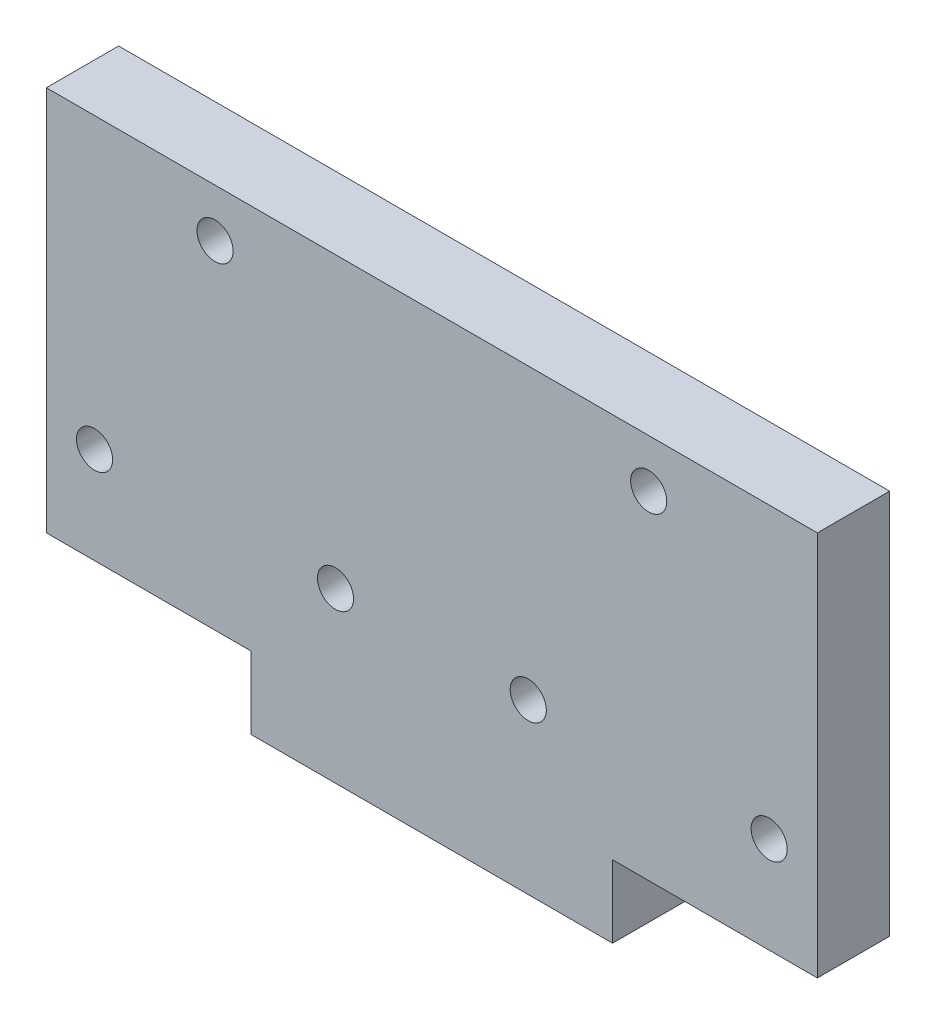
ISO-10303-21;
HEADER;
FILE_DESCRIPTION(('STEP AP214'),'2;1');
FILE_NAME('part.step','',(''),(''),'','','');
FILE_SCHEMA(('AUTOMOTIVE_DESIGN { 1 0 10303 214 1 1 1 1 }'));
ENDSEC;
DATA;
#1=APPLICATION_CONTEXT('core data for automotive mechanical design processes');
#2=APPLICATION_PROTOCOL_DEFINITION('international standard','automotive_design',2000,#1);
#3=PRODUCT_CONTEXT('',#1,'mechanical');
#4=PRODUCT('Part','Part','',(#3));
#5=PRODUCT_RELATED_PRODUCT_CATEGORY('part','',(#4));
#6=PRODUCT_DEFINITION_FORMATION('','',#4);
#7=PRODUCT_DEFINITION_CONTEXT('part definition',#1,'design');
#8=PRODUCT_DEFINITION('design','',#6,#7);
#9=PRODUCT_DEFINITION_SHAPE('','',#8);
#10=(LENGTH_UNIT() NAMED_UNIT(*) SI_UNIT(.MILLI.,.METRE.));
#11=(NAMED_UNIT(*) PLANE_ANGLE_UNIT() SI_UNIT($,.RADIAN.));
#12=(NAMED_UNIT(*) SI_UNIT($,.STERADIAN.) SOLID_ANGLE_UNIT());
#13=UNCERTAINTY_MEASURE_WITH_UNIT(LENGTH_MEASURE(1.E-05),#10,'distance_accuracy_value','');
#14=(GEOMETRIC_REPRESENTATION_CONTEXT(3) GLOBAL_UNCERTAINTY_ASSIGNED_CONTEXT((#13)) GLOBAL_UNIT_ASSIGNED_CONTEXT((#10,
#11,#12)) REPRESENTATION_CONTEXT('',''));
#15=CARTESIAN_POINT('',(0.,0.,0.));
#16=DIRECTION('',(0.,0.,1.));
#17=DIRECTION('',(1.,0.,0.));
#18=AXIS2_PLACEMENT_3D('',#15,#16,#17);
#19=CARTESIAN_POINT('',(-50.,-4.,6.));
#20=DIRECTION('',(0.,0.,-1.));
#21=DIRECTION('',(-1.,0.,0.));
#22=AXIS2_PLACEMENT_3D('',#19,#20,#21);
#23=CYLINDRICAL_SURFACE('',#22,1.5);
#24=CARTESIAN_POINT('',(-50.,-4.,6.));
#25=DIRECTION('',(0.,0.,-1.));
#26=DIRECTION('',(1.,0.,0.));
#27=AXIS2_PLACEMENT_3D('',#24,#25,#26);
#28=CIRCLE('',#27,1.5);
#29=CARTESIAN_POINT('',(-48.5,-4.,6.));
#30=VERTEX_POINT('',#29);
#31=EDGE_CURVE('E161',#30,#30,#28,.T.);
#32=ORIENTED_EDGE('',*,*,#31,.F.);
#33=EDGE_LOOP('',(#32));
#34=FACE_BOUND('',#33,.T.);
#35=CARTESIAN_POINT('',(-50.,-4.,3.));
#36=DIRECTION('',(0.,0.,-1.));
#37=DIRECTION('',(-1.,0.,0.));
#38=AXIS2_PLACEMENT_3D('',#35,#36,#37);
#39=CIRCLE('',#38,1.5);
#40=CARTESIAN_POINT('',(-51.5,-4.,3.));
#41=VERTEX_POINT('',#40);
#42=EDGE_CURVE('E36',#41,#41,#39,.F.);
#43=ORIENTED_EDGE('',*,*,#42,.F.);
#44=EDGE_LOOP('',(#43));
#45=FACE_BOUND('',#44,.T.);
#46=ADVANCED_FACE('F32',(#34,#45),#23,.F.);
#47=CARTESIAN_POINT('',(-60.,-24.,6.));
#48=DIRECTION('',(0.,0.,-1.));
#49=DIRECTION('',(-1.,0.,0.));
#50=AXIS2_PLACEMENT_3D('',#47,#48,#49);
#51=CYLINDRICAL_SURFACE('',#50,1.5);
#52=CARTESIAN_POINT('',(-60.,-24.,6.));
#53=DIRECTION('',(0.,0.,-1.));
#54=DIRECTION('',(1.,0.,0.));
#55=AXIS2_PLACEMENT_3D('',#52,#53,#54);
#56=CIRCLE('',#55,1.5);
#57=CARTESIAN_POINT('',(-58.5,-24.,6.));
#58=VERTEX_POINT('',#57);
#59=EDGE_CURVE('E212',#58,#58,#56,.T.);
#60=ORIENTED_EDGE('',*,*,#59,.F.);
#61=EDGE_LOOP('',(#60));
#62=FACE_BOUND('',#61,.T.);
#63=CARTESIAN_POINT('',(-60.,-24.,3.));
#64=DIRECTION('',(0.,0.,-1.));
#65=DIRECTION('',(-1.,0.,0.));
#66=AXIS2_PLACEMENT_3D('',#63,#64,#65);
#67=CIRCLE('',#66,1.5);
#68=CARTESIAN_POINT('',(-61.5,-24.,3.));
#69=VERTEX_POINT('',#68);
#70=EDGE_CURVE('E177',#69,#69,#67,.F.);
#71=ORIENTED_EDGE('',*,*,#70,.F.);
#72=EDGE_LOOP('',(#71));
#73=FACE_BOUND('',#72,.T.);
#74=ADVANCED_FACE('F260',(#62,#73),#51,.F.);
#75=CARTESIAN_POINT('',(-40.,-24.,6.));
#76=DIRECTION('',(0.,0.,-1.));
#77=DIRECTION('',(-1.,0.,0.));
#78=AXIS2_PLACEMENT_3D('',#75,#76,#77);
#79=CYLINDRICAL_SURFACE('',#78,1.5);
#80=CARTESIAN_POINT('',(-40.,-24.,6.));
#81=DIRECTION('',(0.,0.,-1.));
#82=DIRECTION('',(1.,0.,0.));
#83=AXIS2_PLACEMENT_3D('',#80,#81,#82);
#84=CIRCLE('',#83,1.5);
#85=CARTESIAN_POINT('',(-38.5,-24.,6.));
#86=VERTEX_POINT('',#85);
#87=EDGE_CURVE('E215',#86,#86,#84,.T.);
#88=ORIENTED_EDGE('',*,*,#87,.F.);
#89=EDGE_LOOP('',(#88));
#90=FACE_BOUND('',#89,.T.);
#91=CARTESIAN_POINT('',(-40.,-24.,3.));
#92=DIRECTION('',(0.,0.,-1.));
#93=DIRECTION('',(-1.,0.,0.));
#94=AXIS2_PLACEMENT_3D('',#91,#92,#93);
#95=CIRCLE('',#94,1.5);
#96=CARTESIAN_POINT('',(-41.5,-24.,3.));
#97=VERTEX_POINT('',#96);
#98=EDGE_CURVE('E173',#97,#97,#95,.F.);
#99=ORIENTED_EDGE('',*,*,#98,.F.);
#100=EDGE_LOOP('',(#99));
#101=FACE_BOUND('',#100,.T.);
#102=ADVANCED_FACE('F266',(#90,#101),#79,.F.);
#103=CARTESIAN_POINT('',(-24.,-24.,6.));
#104=DIRECTION('',(0.,0.,-1.));
#105=DIRECTION('',(-1.,0.,0.));
#106=AXIS2_PLACEMENT_3D('',#103,#104,#105);
#107=CYLINDRICAL_SURFACE('',#106,1.5);
#108=CARTESIAN_POINT('',(-24.,-24.,6.));
#109=DIRECTION('',(0.,0.,-1.));
#110=DIRECTION('',(-1.,0.,0.));
#111=AXIS2_PLACEMENT_3D('',#108,#109,#110);
#112=CIRCLE('',#111,1.5);
#113=CARTESIAN_POINT('',(-25.5,-24.,6.));
#114=VERTEX_POINT('',#113);
#115=EDGE_CURVE('E218',#114,#114,#112,.T.);
#116=ORIENTED_EDGE('',*,*,#115,.F.);
#117=EDGE_LOOP('',(#116));
#118=FACE_BOUND('',#117,.T.);
#119=CARTESIAN_POINT('',(-24.,-24.,3.));
#120=DIRECTION('',(0.,0.,-1.));
#121=DIRECTION('',(-1.,0.,0.));
#122=AXIS2_PLACEMENT_3D('',#119,#120,#121);
#123=CIRCLE('',#122,1.5);
#124=CARTESIAN_POINT('',(-25.5,-24.,3.));
#125=VERTEX_POINT('',#124);
#126=EDGE_CURVE('E168',#125,#125,#123,.F.);
#127=ORIENTED_EDGE('',*,*,#126,.F.);
#128=EDGE_LOOP('',(#127));
#129=FACE_BOUND('',#128,.T.);
#130=ADVANCED_FACE('F277',(#118,#129),#107,.F.);
#131=CARTESIAN_POINT('',(-4.,-24.,6.));
#132=DIRECTION('',(0.,0.,-1.));
#133=DIRECTION('',(-1.,0.,0.));
#134=AXIS2_PLACEMENT_3D('',#131,#132,#133);
#135=CYLINDRICAL_SURFACE('',#134,1.5);
#136=CARTESIAN_POINT('',(-4.,-24.,6.));
#137=DIRECTION('',(0.,0.,-1.));
#138=DIRECTION('',(-1.,0.,0.));
#139=AXIS2_PLACEMENT_3D('',#136,#137,#138);
#140=CIRCLE('',#139,1.5);
#141=CARTESIAN_POINT('',(-5.5,-24.,6.));
#142=VERTEX_POINT('',#141);
#143=EDGE_CURVE('E221',#142,#142,#140,.T.);
#144=ORIENTED_EDGE('',*,*,#143,.F.);
#145=EDGE_LOOP('',(#144));
#146=FACE_BOUND('',#145,.T.);
#147=CARTESIAN_POINT('',(-4.,-24.,3.));
#148=DIRECTION('',(0.,0.,-1.));
#149=DIRECTION('',(-1.,0.,0.));
#150=AXIS2_PLACEMENT_3D('',#147,#148,#149);
#151=CIRCLE('',#150,1.5);
#152=CARTESIAN_POINT('',(-5.5,-24.,3.));
#153=VERTEX_POINT('',#152);
#154=EDGE_CURVE('E163',#153,#153,#151,.F.);
#155=ORIENTED_EDGE('',*,*,#154,.F.);
#156=EDGE_LOOP('',(#155));
#157=FACE_BOUND('',#156,.T.);
#158=ADVANCED_FACE('F281',(#146,#157),#135,.F.);
#159=CARTESIAN_POINT('',(-14.,-4.,6.));
#160=DIRECTION('',(0.,0.,-1.));
#161=DIRECTION('',(-1.,0.,0.));
#162=AXIS2_PLACEMENT_3D('',#159,#160,#161);
#163=CYLINDRICAL_SURFACE('',#162,1.5);
#164=CARTESIAN_POINT('',(-14.,-4.,6.));
#165=DIRECTION('',(0.,0.,-1.));
#166=DIRECTION('',(-1.,0.,0.));
#167=AXIS2_PLACEMENT_3D('',#164,#165,#166);
#168=CIRCLE('',#167,1.5);
#169=CARTESIAN_POINT('',(-15.5,-4.,6.));
#170=VERTEX_POINT('',#169);
#171=EDGE_CURVE('E135',#170,#170,#168,.T.);
#172=ORIENTED_EDGE('',*,*,#171,.F.);
#173=EDGE_LOOP('',(#172));
#174=FACE_BOUND('',#173,.T.);
#175=CARTESIAN_POINT('',(-14.,-4.,3.));
#176=DIRECTION('',(0.,0.,-1.));
#177=DIRECTION('',(-1.,0.,0.));
#178=AXIS2_PLACEMENT_3D('',#175,#176,#177);
#179=CIRCLE('',#178,1.5);
#180=CARTESIAN_POINT('',(-15.5,-4.,3.));
#181=VERTEX_POINT('',#180);
#182=EDGE_CURVE('E158',#181,#181,#179,.F.);
#183=ORIENTED_EDGE('',*,*,#182,.F.);
#184=EDGE_LOOP('',(#183));
#185=FACE_BOUND('',#184,.T.);
#186=ADVANCED_FACE('F285',(#174,#185),#163,.F.);
#187=CARTESIAN_POINT('',(0.,0.,6.));
#188=DIRECTION('',(-1.,0.,0.));
#189=DIRECTION('',(0.,-1.,0.));
#190=AXIS2_PLACEMENT_3D('',#187,#188,#189);
#191=PLANE('',#190);
#192=DIRECTION('',(0.,1.,0.));
#193=VECTOR('',#192,1.);
#194=CARTESIAN_POINT('',(0.,0.,0.));
#195=LINE('',#194,#193);
#196=CARTESIAN_POINT('',(0.,-32.,0.));
#197=VERTEX_POINT('',#196);
#198=CARTESIAN_POINT('',(0.,0.,0.));
#199=VERTEX_POINT('',#198);
#200=EDGE_CURVE('E131',#197,#199,#195,.T.);
#201=ORIENTED_EDGE('',*,*,#200,.T.);
#202=DIRECTION('',(0.,0.,-1.));
#203=VECTOR('',#202,1.);
#204=CARTESIAN_POINT('',(0.,0.,6.));
#205=LINE('',#204,#203);
#206=CARTESIAN_POINT('',(0.,0.,6.));
#207=VERTEX_POINT('',#206);
#208=EDGE_CURVE('E11',#207,#199,#205,.T.);
#209=ORIENTED_EDGE('',*,*,#208,.F.);
#210=DIRECTION('',(0.,1.,0.));
#211=VECTOR('',#210,1.);
#212=CARTESIAN_POINT('',(0.,0.,6.));
#213=LINE('',#212,#211);
#214=CARTESIAN_POINT('',(0.,-32.,6.));
#215=VERTEX_POINT('',#214);
#216=EDGE_CURVE('E146',#215,#207,#213,.T.);
#217=ORIENTED_EDGE('',*,*,#216,.F.);
#218=DIRECTION('',(0.,0.,-1.));
#219=VECTOR('',#218,1.);
#220=CARTESIAN_POINT('',(0.,-32.,6.));
#221=LINE('',#220,#219);
#222=EDGE_CURVE('E127',#215,#197,#221,.T.);
#223=ORIENTED_EDGE('',*,*,#222,.T.);
#224=EDGE_LOOP('',(#201,#209,#217,#223));
#225=FACE_BOUND('',#224,.T.);
#226=ADVANCED_FACE('F34',(#225),#191,.F.);
#227=CARTESIAN_POINT('',(0.,0.,6.));
#228=DIRECTION('',(0.,-1.,0.));
#229=DIRECTION('',(1.,0.,0.));
#230=AXIS2_PLACEMENT_3D('',#227,#228,#229);
#231=PLANE('',#230);
#232=DIRECTION('',(-1.,0.,0.));
#233=VECTOR('',#232,1.);
#234=CARTESIAN_POINT('',(0.,0.,0.));
#235=LINE('',#234,#233);
#236=CARTESIAN_POINT('',(-64.,0.,0.));
#237=VERTEX_POINT('',#236);
#238=EDGE_CURVE('E134',#199,#237,#235,.T.);
#239=ORIENTED_EDGE('',*,*,#238,.T.);
#240=DIRECTION('',(0.,0.,-1.));
#241=VECTOR('',#240,1.);
#242=CARTESIAN_POINT('',(-64.,0.,6.));
#243=LINE('',#242,#241);
#244=CARTESIAN_POINT('',(-64.,0.,6.));
#245=VERTEX_POINT('',#244);
#246=EDGE_CURVE('E42',#245,#237,#243,.T.);
#247=ORIENTED_EDGE('',*,*,#246,.F.);
#248=DIRECTION('',(-1.,0.,0.));
#249=VECTOR('',#248,1.);
#250=CARTESIAN_POINT('',(0.,0.,6.));
#251=LINE('',#250,#249);
#252=EDGE_CURVE('E94',#207,#245,#251,.T.);
#253=ORIENTED_EDGE('',*,*,#252,.F.);
#254=ORIENTED_EDGE('',*,*,#208,.T.);
#255=EDGE_LOOP('',(#239,#247,#253,#254));
#256=FACE_BOUND('',#255,.T.);
#257=ADVANCED_FACE('F502',(#256),#231,.F.);
#258=CARTESIAN_POINT('',(-64.,0.,6.));
#259=DIRECTION('',(1.,0.,0.));
#260=DIRECTION('',(0.,0.,-1.));
#261=AXIS2_PLACEMENT_3D('',#258,#259,#260);
#262=PLANE('',#261);
#263=DIRECTION('',(0.,-1.,0.));
#264=VECTOR('',#263,1.);
#265=CARTESIAN_POINT('',(-64.,0.,0.));
#266=LINE('',#265,#264);
#267=CARTESIAN_POINT('',(-64.,-32.,0.));
#268=VERTEX_POINT('',#267);
#269=EDGE_CURVE('E137',#237,#268,#266,.T.);
#270=ORIENTED_EDGE('',*,*,#269,.T.);
#271=DIRECTION('',(0.,0.,-1.));
#272=VECTOR('',#271,1.);
#273=CARTESIAN_POINT('',(-64.,-32.,6.));
#274=LINE('',#273,#272);
#275=CARTESIAN_POINT('',(-64.,-32.,6.));
#276=VERTEX_POINT('',#275);
#277=EDGE_CURVE('E153',#276,#268,#274,.T.);
#278=ORIENTED_EDGE('',*,*,#277,.F.);
#279=DIRECTION('',(0.,-1.,0.));
#280=VECTOR('',#279,1.);
#281=CARTESIAN_POINT('',(-64.,0.,6.));
#282=LINE('',#281,#280);
#283=EDGE_CURVE('E228',#245,#276,#282,.T.);
#284=ORIENTED_EDGE('',*,*,#283,.F.);
#285=ORIENTED_EDGE('',*,*,#246,.T.);
#286=EDGE_LOOP('',(#270,#278,#284,#285));
#287=FACE_BOUND('',#286,.T.);
#288=ADVANCED_FACE('F494',(#287),#262,.F.);
#289=CARTESIAN_POINT('',(-47.,-32.,6.));
#290=DIRECTION('',(0.,1.,0.));
#291=DIRECTION('',(0.,0.,1.));
#292=AXIS2_PLACEMENT_3D('',#289,#290,#291);
#293=PLANE('',#292);
#294=DIRECTION('',(1.,0.,0.));
#295=VECTOR('',#294,1.);
#296=CARTESIAN_POINT('',(-47.,-32.,0.));
#297=LINE('',#296,#295);
#298=CARTESIAN_POINT('',(-47.,-32.,0.));
#299=VERTEX_POINT('',#298);
#300=EDGE_CURVE('E139',#268,#299,#297,.T.);
#301=ORIENTED_EDGE('',*,*,#300,.T.);
#302=DIRECTION('',(0.,0.,-1.));
#303=VECTOR('',#302,1.);
#304=CARTESIAN_POINT('',(-47.,-32.,6.));
#305=LINE('',#304,#303);
#306=CARTESIAN_POINT('',(-47.,-32.,6.));
#307=VERTEX_POINT('',#306);
#308=EDGE_CURVE('E150',#307,#299,#305,.T.);
#309=ORIENTED_EDGE('',*,*,#308,.F.);
#310=DIRECTION('',(1.,0.,0.));
#311=VECTOR('',#310,1.);
#312=CARTESIAN_POINT('',(-47.,-32.,6.));
#313=LINE('',#312,#311);
#314=EDGE_CURVE('E230',#276,#307,#313,.T.);
#315=ORIENTED_EDGE('',*,*,#314,.F.);
#316=ORIENTED_EDGE('',*,*,#277,.T.);
#317=EDGE_LOOP('',(#301,#309,#315,#316));
#318=FACE_BOUND('',#317,.T.);
#319=ADVANCED_FACE('F236',(#318),#293,.F.);
#320=CARTESIAN_POINT('',(-47.,-38.,6.));
#321=DIRECTION('',(1.,0.,0.));
#322=DIRECTION('',(0.,0.,-1.));
#323=AXIS2_PLACEMENT_3D('',#320,#321,#322);
#324=PLANE('',#323);
#325=DIRECTION('',(0.,-1.,0.));
#326=VECTOR('',#325,1.);
#327=CARTESIAN_POINT('',(-47.,-38.,0.));
#328=LINE('',#327,#326);
#329=CARTESIAN_POINT('',(-47.,-38.,0.));
#330=VERTEX_POINT('',#329);
#331=EDGE_CURVE('E141',#299,#330,#328,.T.);
#332=ORIENTED_EDGE('',*,*,#331,.T.);
#333=DIRECTION('',(0.,0.,-1.));
#334=VECTOR('',#333,1.);
#335=CARTESIAN_POINT('',(-47.,-38.,6.));
#336=LINE('',#335,#334);
#337=CARTESIAN_POINT('',(-47.,-38.,6.));
#338=VERTEX_POINT('',#337);
#339=EDGE_CURVE('E122',#338,#330,#336,.T.);
#340=ORIENTED_EDGE('',*,*,#339,.F.);
#341=DIRECTION('',(0.,-1.,0.));
#342=VECTOR('',#341,1.);
#343=CARTESIAN_POINT('',(-47.,-38.,6.));
#344=LINE('',#343,#342);
#345=EDGE_CURVE('E113',#307,#338,#344,.T.);
#346=ORIENTED_EDGE('',*,*,#345,.F.);
#347=ORIENTED_EDGE('',*,*,#308,.T.);
#348=EDGE_LOOP('',(#332,#340,#346,#347));
#349=FACE_BOUND('',#348,.T.);
#350=ADVANCED_FACE('F240',(#349),#324,.F.);
#351=CARTESIAN_POINT('',(-17.,-38.,6.));
#352=DIRECTION('',(0.,1.,0.));
#353=DIRECTION('',(-1.,0.,0.));
#354=AXIS2_PLACEMENT_3D('',#351,#352,#353);
#355=PLANE('',#354);
#356=DIRECTION('',(1.,0.,0.));
#357=VECTOR('',#356,1.);
#358=CARTESIAN_POINT('',(-17.,-38.,0.));
#359=LINE('',#358,#357);
#360=CARTESIAN_POINT('',(-17.,-38.,0.));
#361=VERTEX_POINT('',#360);
#362=EDGE_CURVE('E121',#330,#361,#359,.T.);
#363=ORIENTED_EDGE('',*,*,#362,.T.);
#364=DIRECTION('',(0.,0.,-1.));
#365=VECTOR('',#364,1.);
#366=CARTESIAN_POINT('',(-17.,-38.,6.));
#367=LINE('',#366,#365);
#368=CARTESIAN_POINT('',(-17.,-38.,6.));
#369=VERTEX_POINT('',#368);
#370=EDGE_CURVE('E118',#369,#361,#367,.T.);
#371=ORIENTED_EDGE('',*,*,#370,.F.);
#372=DIRECTION('',(1.,0.,0.));
#373=VECTOR('',#372,1.);
#374=CARTESIAN_POINT('',(-17.,-38.,6.));
#375=LINE('',#374,#373);
#376=EDGE_CURVE('E107',#338,#369,#375,.T.);
#377=ORIENTED_EDGE('',*,*,#376,.F.);
#378=ORIENTED_EDGE('',*,*,#339,.T.);
#379=EDGE_LOOP('',(#363,#371,#377,#378));
#380=FACE_BOUND('',#379,.T.);
#381=ADVANCED_FACE('F119',(#380),#355,.F.);
#382=CARTESIAN_POINT('',(-17.,-32.,6.));
#383=DIRECTION('',(-1.,0.,0.));
#384=DIRECTION('',(0.,0.,1.));
#385=AXIS2_PLACEMENT_3D('',#382,#383,#384);
#386=PLANE('',#385);
#387=DIRECTION('',(0.,1.,0.));
#388=VECTOR('',#387,1.);
#389=CARTESIAN_POINT('',(-17.,-32.,0.));
#390=LINE('',#389,#388);
#391=CARTESIAN_POINT('',(-17.,-32.,0.));
#392=VERTEX_POINT('',#391);
#393=EDGE_CURVE('E80',#361,#392,#390,.T.);
#394=ORIENTED_EDGE('',*,*,#393,.T.);
#395=DIRECTION('',(0.,0.,-1.));
#396=VECTOR('',#395,1.);
#397=CARTESIAN_POINT('',(-17.,-32.,6.));
#398=LINE('',#397,#396);
#399=CARTESIAN_POINT('',(-17.,-32.,6.));
#400=VERTEX_POINT('',#399);
#401=EDGE_CURVE('E123',#400,#392,#398,.T.);
#402=ORIENTED_EDGE('',*,*,#401,.F.);
#403=DIRECTION('',(0.,1.,0.));
#404=VECTOR('',#403,1.);
#405=CARTESIAN_POINT('',(-17.,-32.,6.));
#406=LINE('',#405,#404);
#407=EDGE_CURVE('E111',#369,#400,#406,.T.);
#408=ORIENTED_EDGE('',*,*,#407,.F.);
#409=ORIENTED_EDGE('',*,*,#370,.T.);
#410=EDGE_LOOP('',(#394,#402,#408,#409));
#411=FACE_BOUND('',#410,.T.);
#412=ADVANCED_FACE('F125',(#411),#386,.F.);
#413=CARTESIAN_POINT('',(0.,-32.,6.));
#414=DIRECTION('',(0.,1.,0.));
#415=DIRECTION('',(0.,0.,1.));
#416=AXIS2_PLACEMENT_3D('',#413,#414,#415);
#417=PLANE('',#416);
#418=DIRECTION('',(1.,0.,0.));
#419=VECTOR('',#418,1.);
#420=CARTESIAN_POINT('',(0.,-32.,0.));
#421=LINE('',#420,#419);
#422=EDGE_CURVE('E86',#392,#197,#421,.T.);
#423=ORIENTED_EDGE('',*,*,#422,.T.);
#424=ORIENTED_EDGE('',*,*,#222,.F.);
#425=DIRECTION('',(1.,0.,0.));
#426=VECTOR('',#425,1.);
#427=CARTESIAN_POINT('',(0.,-32.,6.));
#428=LINE('',#427,#426);
#429=EDGE_CURVE('E51',#400,#215,#428,.T.);
#430=ORIENTED_EDGE('',*,*,#429,.F.);
#431=ORIENTED_EDGE('',*,*,#401,.T.);
#432=EDGE_LOOP('',(#423,#424,#430,#431));
#433=FACE_BOUND('',#432,.T.);
#434=ADVANCED_FACE('F248',(#433),#417,.F.);
#435=CARTESIAN_POINT('',(0.,0.,6.));
#436=DIRECTION('',(0.,0.,-1.));
#437=DIRECTION('',(-1.,0.,0.));
#438=AXIS2_PLACEMENT_3D('',#435,#436,#437);
#439=PLANE('',#438);
#440=ORIENTED_EDGE('',*,*,#31,.T.);
#441=EDGE_LOOP('',(#440));
#442=FACE_BOUND('',#441,.T.);
#443=ORIENTED_EDGE('',*,*,#59,.T.);
#444=EDGE_LOOP('',(#443));
#445=FACE_BOUND('',#444,.T.);
#446=ORIENTED_EDGE('',*,*,#87,.T.);
#447=EDGE_LOOP('',(#446));
#448=FACE_BOUND('',#447,.T.);
#449=ORIENTED_EDGE('',*,*,#115,.T.);
#450=EDGE_LOOP('',(#449));
#451=FACE_BOUND('',#450,.T.);
#452=ORIENTED_EDGE('',*,*,#143,.T.);
#453=EDGE_LOOP('',(#452));
#454=FACE_BOUND('',#453,.T.);
#455=ORIENTED_EDGE('',*,*,#171,.T.);
#456=EDGE_LOOP('',(#455));
#457=FACE_BOUND('',#456,.T.);
#458=ORIENTED_EDGE('',*,*,#216,.T.);
#459=ORIENTED_EDGE('',*,*,#252,.T.);
#460=ORIENTED_EDGE('',*,*,#283,.T.);
#461=ORIENTED_EDGE('',*,*,#314,.T.);
#462=ORIENTED_EDGE('',*,*,#345,.T.);
#463=ORIENTED_EDGE('',*,*,#376,.T.);
#464=ORIENTED_EDGE('',*,*,#407,.T.);
#465=ORIENTED_EDGE('',*,*,#429,.T.);
#466=EDGE_LOOP('',(#458,#459,#460,#461,#462,#463,#464,#465));
#467=FACE_BOUND('',#466,.T.);
#468=ADVANCED_FACE('F109',(#442,#445,#448,#451,#454,#457,#467),#439,.F.);
#469=CARTESIAN_POINT('',(0.,0.,0.));
#470=DIRECTION('',(0.,0.,-1.));
#471=DIRECTION('',(-1.,0.,0.));
#472=AXIS2_PLACEMENT_3D('',#469,#470,#471);
#473=PLANE('',#472);
#474=CARTESIAN_POINT('',(-50.,-4.,0.));
#475=DIRECTION('',(0.,0.,-1.));
#476=DIRECTION('',(-1.,0.,0.));
#477=AXIS2_PLACEMENT_3D('',#474,#475,#476);
#478=CIRCLE('',#477,3.);
#479=CARTESIAN_POINT('',(-53.,-4.,0.));
#480=VERTEX_POINT('',#479);
#481=EDGE_CURVE('E193',#480,#480,#478,.T.);
#482=ORIENTED_EDGE('',*,*,#481,.F.);
#483=EDGE_LOOP('',(#482));
#484=FACE_BOUND('',#483,.T.);
#485=CARTESIAN_POINT('',(-60.,-24.,0.));
#486=DIRECTION('',(0.,0.,-1.));
#487=DIRECTION('',(-1.,0.,0.));
#488=AXIS2_PLACEMENT_3D('',#485,#486,#487);
#489=CIRCLE('',#488,3.00000000000001);
#490=CARTESIAN_POINT('',(-63.,-24.,0.));
#491=VERTEX_POINT('',#490);
#492=EDGE_CURVE('E186',#491,#491,#489,.T.);
#493=ORIENTED_EDGE('',*,*,#492,.F.);
#494=EDGE_LOOP('',(#493));
#495=FACE_BOUND('',#494,.T.);
#496=CARTESIAN_POINT('',(-40.,-24.,0.));
#497=DIRECTION('',(0.,0.,-1.));
#498=DIRECTION('',(-1.,0.,0.));
#499=AXIS2_PLACEMENT_3D('',#496,#497,#498);
#500=CIRCLE('',#499,3.);
#501=CARTESIAN_POINT('',(-43.,-24.,0.));
#502=VERTEX_POINT('',#501);
#503=EDGE_CURVE('E179',#502,#502,#500,.T.);
#504=ORIENTED_EDGE('',*,*,#503,.F.);
#505=EDGE_LOOP('',(#504));
#506=FACE_BOUND('',#505,.T.);
#507=CARTESIAN_POINT('',(-24.,-24.,0.));
#508=DIRECTION('',(0.,0.,-1.));
#509=DIRECTION('',(-1.,0.,0.));
#510=AXIS2_PLACEMENT_3D('',#507,#508,#509);
#511=CIRCLE('',#510,3.);
#512=CARTESIAN_POINT('',(-27.,-24.,0.));
#513=VERTEX_POINT('',#512);
#514=EDGE_CURVE('E175',#513,#513,#511,.T.);
#515=ORIENTED_EDGE('',*,*,#514,.F.);
#516=EDGE_LOOP('',(#515));
#517=FACE_BOUND('',#516,.T.);
#518=CARTESIAN_POINT('',(-4.,-24.,0.));
#519=DIRECTION('',(0.,0.,-1.));
#520=DIRECTION('',(-1.,0.,0.));
#521=AXIS2_PLACEMENT_3D('',#518,#519,#520);
#522=CIRCLE('',#521,3.);
#523=CARTESIAN_POINT('',(-7.,-24.,0.));
#524=VERTEX_POINT('',#523);
#525=EDGE_CURVE('E171',#524,#524,#522,.T.);
#526=ORIENTED_EDGE('',*,*,#525,.F.);
#527=EDGE_LOOP('',(#526));
#528=FACE_BOUND('',#527,.T.);
#529=CARTESIAN_POINT('',(-14.,-4.,0.));
#530=DIRECTION('',(0.,0.,-1.));
#531=DIRECTION('',(-1.,0.,0.));
#532=AXIS2_PLACEMENT_3D('',#529,#530,#531);
#533=CIRCLE('',#532,3.);
#534=CARTESIAN_POINT('',(-17.,-4.,0.));
#535=VERTEX_POINT('',#534);
#536=EDGE_CURVE('E166',#535,#535,#533,.T.);
#537=ORIENTED_EDGE('',*,*,#536,.F.);
#538=EDGE_LOOP('',(#537));
#539=FACE_BOUND('',#538,.T.);
#540=ORIENTED_EDGE('',*,*,#200,.F.);
#541=ORIENTED_EDGE('',*,*,#422,.F.);
#542=ORIENTED_EDGE('',*,*,#393,.F.);
#543=ORIENTED_EDGE('',*,*,#362,.F.);
#544=ORIENTED_EDGE('',*,*,#331,.F.);
#545=ORIENTED_EDGE('',*,*,#300,.F.);
#546=ORIENTED_EDGE('',*,*,#269,.F.);
#547=ORIENTED_EDGE('',*,*,#238,.F.);
#548=EDGE_LOOP('',(#540,#541,#542,#543,#544,#545,#546,#547));
#549=FACE_BOUND('',#548,.T.);
#550=ADVANCED_FACE('F243',(#484,#495,#506,#517,#528,#539,#549),#473,.T.);
#551=CARTESIAN_POINT('',(-14.,-4.,3.));
#552=DIRECTION('',(0.,0.,-1.));
#553=DIRECTION('',(-1.,0.,0.));
#554=AXIS2_PLACEMENT_3D('',#551,#552,#553);
#555=PLANE('',#554);
#556=CARTESIAN_POINT('',(-14.,-4.,3.));
#557=DIRECTION('',(0.,0.,-1.));
#558=DIRECTION('',(-1.,0.,0.));
#559=AXIS2_PLACEMENT_3D('',#556,#557,#558);
#560=CIRCLE('',#559,3.);
#561=CARTESIAN_POINT('',(-17.,-4.,3.));
#562=VERTEX_POINT('',#561);
#563=EDGE_CURVE('E162',#562,#562,#560,.T.);
#564=ORIENTED_EDGE('',*,*,#563,.T.);
#565=EDGE_LOOP('',(#564));
#566=FACE_BOUND('',#565,.T.);
#567=ORIENTED_EDGE('',*,*,#182,.T.);
#568=EDGE_LOOP('',(#567));
#569=FACE_BOUND('',#568,.T.);
#570=ADVANCED_FACE('F290',(#566,#569),#555,.T.);
#571=CARTESIAN_POINT('',(-14.,-4.,3.));
#572=DIRECTION('',(0.,0.,-1.));
#573=DIRECTION('',(-1.,0.,0.));
#574=AXIS2_PLACEMENT_3D('',#571,#572,#573);
#575=CYLINDRICAL_SURFACE('',#574,3.);
#576=ORIENTED_EDGE('',*,*,#563,.F.);
#577=EDGE_LOOP('',(#576));
#578=FACE_BOUND('',#577,.T.);
#579=ORIENTED_EDGE('',*,*,#536,.T.);
#580=EDGE_LOOP('',(#579));
#581=FACE_BOUND('',#580,.T.);
#582=ADVANCED_FACE('F272',(#578,#581),#575,.F.);
#583=CARTESIAN_POINT('',(-4.,-24.,3.));
#584=DIRECTION('',(0.,0.,-1.));
#585=DIRECTION('',(-1.,0.,0.));
#586=AXIS2_PLACEMENT_3D('',#583,#584,#585);
#587=PLANE('',#586);
#588=CARTESIAN_POINT('',(-4.,-24.,3.));
#589=DIRECTION('',(0.,0.,-1.));
#590=DIRECTION('',(-1.,0.,0.));
#591=AXIS2_PLACEMENT_3D('',#588,#589,#590);
#592=CIRCLE('',#591,3.);
#593=CARTESIAN_POINT('',(-7.,-24.,3.));
#594=VERTEX_POINT('',#593);
#595=EDGE_CURVE('E167',#594,#594,#592,.T.);
#596=ORIENTED_EDGE('',*,*,#595,.T.);
#597=EDGE_LOOP('',(#596));
#598=FACE_BOUND('',#597,.T.);
#599=ORIENTED_EDGE('',*,*,#154,.T.);
#600=EDGE_LOOP('',(#599));
#601=FACE_BOUND('',#600,.T.);
#602=ADVANCED_FACE('F310',(#598,#601),#587,.T.);
#603=CARTESIAN_POINT('',(-4.,-24.,3.));
#604=DIRECTION('',(0.,0.,-1.));
#605=DIRECTION('',(-1.,0.,0.));
#606=AXIS2_PLACEMENT_3D('',#603,#604,#605);
#607=CYLINDRICAL_SURFACE('',#606,3.);
#608=ORIENTED_EDGE('',*,*,#595,.F.);
#609=EDGE_LOOP('',(#608));
#610=FACE_BOUND('',#609,.T.);
#611=ORIENTED_EDGE('',*,*,#525,.T.);
#612=EDGE_LOOP('',(#611));
#613=FACE_BOUND('',#612,.T.);
#614=ADVANCED_FACE('F315',(#610,#613),#607,.F.);
#615=CARTESIAN_POINT('',(-24.,-24.,3.));
#616=DIRECTION('',(0.,0.,-1.));
#617=DIRECTION('',(-1.,0.,0.));
#618=AXIS2_PLACEMENT_3D('',#615,#616,#617);
#619=PLANE('',#618);
#620=CARTESIAN_POINT('',(-24.,-24.,3.));
#621=DIRECTION('',(0.,0.,-1.));
#622=DIRECTION('',(-1.,0.,0.));
#623=AXIS2_PLACEMENT_3D('',#620,#621,#622);
#624=CIRCLE('',#623,3.);
#625=CARTESIAN_POINT('',(-27.,-24.,3.));
#626=VERTEX_POINT('',#625);
#627=EDGE_CURVE('E172',#626,#626,#624,.T.);
#628=ORIENTED_EDGE('',*,*,#627,.T.);
#629=EDGE_LOOP('',(#628));
#630=FACE_BOUND('',#629,.T.);
#631=ORIENTED_EDGE('',*,*,#126,.T.);
#632=EDGE_LOOP('',(#631));
#633=FACE_BOUND('',#632,.T.);
#634=ADVANCED_FACE('F325',(#630,#633),#619,.T.);
#635=CARTESIAN_POINT('',(-24.,-24.,3.));
#636=DIRECTION('',(0.,0.,-1.));
#637=DIRECTION('',(-1.,0.,0.));
#638=AXIS2_PLACEMENT_3D('',#635,#636,#637);
#639=CYLINDRICAL_SURFACE('',#638,3.);
#640=ORIENTED_EDGE('',*,*,#627,.F.);
#641=EDGE_LOOP('',(#640));
#642=FACE_BOUND('',#641,.T.);
#643=ORIENTED_EDGE('',*,*,#514,.T.);
#644=EDGE_LOOP('',(#643));
#645=FACE_BOUND('',#644,.T.);
#646=ADVANCED_FACE('F330',(#642,#645),#639,.F.);
#647=CARTESIAN_POINT('',(-40.,-24.,3.));
#648=DIRECTION('',(0.,0.,-1.));
#649=DIRECTION('',(-1.,0.,0.));
#650=AXIS2_PLACEMENT_3D('',#647,#648,#649);
#651=PLANE('',#650);
#652=CARTESIAN_POINT('',(-40.,-24.,3.));
#653=DIRECTION('',(0.,0.,-1.));
#654=DIRECTION('',(-1.,0.,0.));
#655=AXIS2_PLACEMENT_3D('',#652,#653,#654);
#656=CIRCLE('',#655,3.);
#657=CARTESIAN_POINT('',(-43.,-24.,3.));
#658=VERTEX_POINT('',#657);
#659=EDGE_CURVE('E176',#658,#658,#656,.T.);
#660=ORIENTED_EDGE('',*,*,#659,.T.);
#661=EDGE_LOOP('',(#660));
#662=FACE_BOUND('',#661,.T.);
#663=ORIENTED_EDGE('',*,*,#98,.T.);
#664=EDGE_LOOP('',(#663));
#665=FACE_BOUND('',#664,.T.);
#666=ADVANCED_FACE('F333',(#662,#665),#651,.T.);
#667=CARTESIAN_POINT('',(-40.,-24.,3.));
#668=DIRECTION('',(0.,0.,-1.));
#669=DIRECTION('',(-1.,0.,0.));
#670=AXIS2_PLACEMENT_3D('',#667,#668,#669);
#671=CYLINDRICAL_SURFACE('',#670,3.);
#672=ORIENTED_EDGE('',*,*,#659,.F.);
#673=EDGE_LOOP('',(#672));
#674=FACE_BOUND('',#673,.T.);
#675=ORIENTED_EDGE('',*,*,#503,.T.);
#676=EDGE_LOOP('',(#675));
#677=FACE_BOUND('',#676,.T.);
#678=ADVANCED_FACE('F338',(#674,#677),#671,.F.);
#679=CARTESIAN_POINT('',(-60.,-24.,3.));
#680=DIRECTION('',(0.,0.,-1.));
#681=DIRECTION('',(-1.,0.,0.));
#682=AXIS2_PLACEMENT_3D('',#679,#680,#681);
#683=PLANE('',#682);
#684=CARTESIAN_POINT('',(-60.,-24.,3.));
#685=DIRECTION('',(0.,0.,-1.));
#686=DIRECTION('',(-1.,0.,0.));
#687=AXIS2_PLACEMENT_3D('',#684,#685,#686);
#688=CIRCLE('',#687,3.00000000000001);
#689=CARTESIAN_POINT('',(-63.,-24.,3.));
#690=VERTEX_POINT('',#689);
#691=EDGE_CURVE('E180',#690,#690,#688,.T.);
#692=ORIENTED_EDGE('',*,*,#691,.T.);
#693=EDGE_LOOP('',(#692));
#694=FACE_BOUND('',#693,.T.);
#695=ORIENTED_EDGE('',*,*,#70,.T.);
#696=EDGE_LOOP('',(#695));
#697=FACE_BOUND('',#696,.T.);
#698=ADVANCED_FACE('F341',(#694,#697),#683,.T.);
#699=CARTESIAN_POINT('',(-60.,-24.,3.));
#700=DIRECTION('',(0.,0.,-1.));
#701=DIRECTION('',(-1.,0.,0.));
#702=AXIS2_PLACEMENT_3D('',#699,#700,#701);
#703=CYLINDRICAL_SURFACE('',#702,3.00000000000001);
#704=ORIENTED_EDGE('',*,*,#691,.F.);
#705=EDGE_LOOP('',(#704));
#706=FACE_BOUND('',#705,.T.);
#707=ORIENTED_EDGE('',*,*,#492,.T.);
#708=EDGE_LOOP('',(#707));
#709=FACE_BOUND('',#708,.T.);
#710=ADVANCED_FACE('F346',(#706,#709),#703,.F.);
#711=CARTESIAN_POINT('',(-50.,-4.,3.));
#712=DIRECTION('',(0.,0.,-1.));
#713=DIRECTION('',(-1.,0.,0.));
#714=AXIS2_PLACEMENT_3D('',#711,#712,#713);
#715=PLANE('',#714);
#716=CARTESIAN_POINT('',(-50.,-4.,3.));
#717=DIRECTION('',(0.,0.,-1.));
#718=DIRECTION('',(-1.,0.,0.));
#719=AXIS2_PLACEMENT_3D('',#716,#717,#718);
#720=CIRCLE('',#719,3.);
#721=CARTESIAN_POINT('',(-53.,-4.,3.));
#722=VERTEX_POINT('',#721);
#723=EDGE_CURVE('E364',#722,#722,#720,.T.);
#724=ORIENTED_EDGE('',*,*,#723,.T.);
#725=EDGE_LOOP('',(#724));
#726=FACE_BOUND('',#725,.T.);
#727=ORIENTED_EDGE('',*,*,#42,.T.);
#728=EDGE_LOOP('',(#727));
#729=FACE_BOUND('',#728,.T.);
#730=ADVANCED_FACE('F349',(#726,#729),#715,.T.);
#731=CARTESIAN_POINT('',(-50.,-4.,3.));
#732=DIRECTION('',(0.,0.,-1.));
#733=DIRECTION('',(-1.,0.,0.));
#734=AXIS2_PLACEMENT_3D('',#731,#732,#733);
#735=CYLINDRICAL_SURFACE('',#734,3.);
#736=ORIENTED_EDGE('',*,*,#723,.F.);
#737=EDGE_LOOP('',(#736));
#738=FACE_BOUND('',#737,.T.);
#739=ORIENTED_EDGE('',*,*,#481,.T.);
#740=EDGE_LOOP('',(#739));
#741=FACE_BOUND('',#740,.T.);
#742=ADVANCED_FACE('F353',(#738,#741),#735,.F.);
#743=CLOSED_SHELL('',(#46,#74,#102,#130,#158,#186,#226,#257,#288,#319,#350,#381,#412,#434,#468,
#550,#570,#582,#602,#614,#634,#646,#666,#678,#698,#710,#730,#742));
#744=MANIFOLD_SOLID_BREP('B2',#743);
#745=ADVANCED_BREP_SHAPE_REPRESENTATION('',(#18,#744),#14);
#746=SHAPE_DEFINITION_REPRESENTATION(#9,#745);
ENDSEC;
END-ISO-10303-21;
